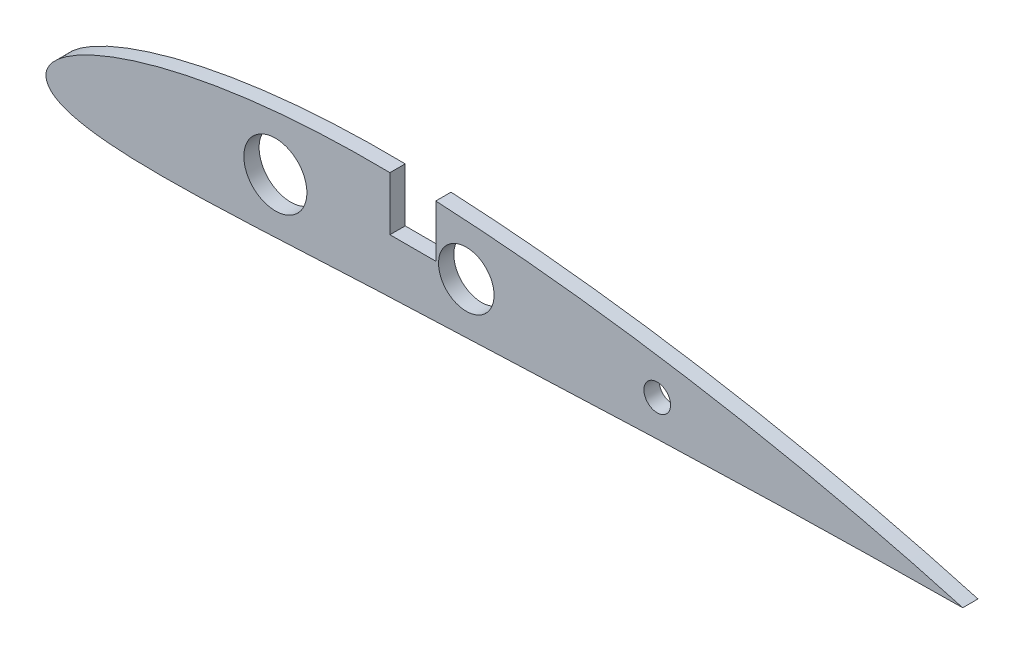
ISO-10303-21;
HEADER;
FILE_DESCRIPTION(('STEP AP214'),'2;1');
FILE_NAME('part.step','',(''),(''),'','','');
FILE_SCHEMA(('AUTOMOTIVE_DESIGN { 1 0 10303 214 1 1 1 1 }'));
ENDSEC;
DATA;
#1=APPLICATION_CONTEXT('core data for automotive mechanical design processes');
#2=APPLICATION_PROTOCOL_DEFINITION('international standard','automotive_design',2000,#1);
#3=PRODUCT_CONTEXT('',#1,'mechanical');
#4=PRODUCT('Part','Part','',(#3));
#5=PRODUCT_RELATED_PRODUCT_CATEGORY('part','',(#4));
#6=PRODUCT_DEFINITION_FORMATION('','',#4);
#7=PRODUCT_DEFINITION_CONTEXT('part definition',#1,'design');
#8=PRODUCT_DEFINITION('design','',#6,#7);
#9=PRODUCT_DEFINITION_SHAPE('','',#8);
#10=(LENGTH_UNIT() NAMED_UNIT(*) SI_UNIT(.MILLI.,.METRE.));
#11=(NAMED_UNIT(*) PLANE_ANGLE_UNIT() SI_UNIT($,.RADIAN.));
#12=(NAMED_UNIT(*) SI_UNIT($,.STERADIAN.) SOLID_ANGLE_UNIT());
#13=UNCERTAINTY_MEASURE_WITH_UNIT(LENGTH_MEASURE(1.E-05),#10,'distance_accuracy_value','');
#14=(GEOMETRIC_REPRESENTATION_CONTEXT(3) GLOBAL_UNCERTAINTY_ASSIGNED_CONTEXT((#13)) GLOBAL_UNIT_ASSIGNED_CONTEXT((#10,
#11,#12)) REPRESENTATION_CONTEXT('',''));
#15=CARTESIAN_POINT('',(0.,0.,0.));
#16=DIRECTION('',(0.,0.,1.));
#17=DIRECTION('',(1.,0.,0.));
#18=AXIS2_PLACEMENT_3D('',#15,#16,#17);
#19=CARTESIAN_POINT('',(240.,0.,4.));
#20=CARTESIAN_POINT('',(237.546398163448,0.68438543221875,4.));
#21=CARTESIAN_POINT('',(232.640819939116,2.05270290872528,4.));
#22=CARTESIAN_POINT('',(225.253408528126,3.98966258912179,4.));
#23=CARTESIAN_POINT('',(217.849539662704,5.84383763989185,4.));
#24=CARTESIAN_POINT('',(210.427797340328,7.60857340531703,4.));
#25=CARTESIAN_POINT('',(202.989689486897,9.28748088681427,4.));
#26=CARTESIAN_POINT('',(195.535844753439,10.8809301447552,4.));
#27=CARTESIAN_POINT('',(188.06704799779,12.3896611860168,4.));
#28=CARTESIAN_POINT('',(180.583977278672,13.813795242563,4.));
#29=CARTESIAN_POINT('',(173.087293463989,15.1530936944043,4.));
#30=CARTESIAN_POINT('',(165.577630233609,16.4068599196889,4.));
#31=CARTESIAN_POINT('',(158.055616956506,17.5739504528987,4.));
#32=CARTESIAN_POINT('',(150.521889928624,18.6527459218232,4.));
#33=CARTESIAN_POINT('',(142.977108491338,19.6411249772645,4.));
#34=CARTESIAN_POINT('',(135.421970655733,20.5364355054947,4.));
#35=CARTESIAN_POINT('',(127.857230033589,21.3354646143863,4.));
#36=CARTESIAN_POINT('',(120.283713821644,22.0343417726445,4.));
#37=CARTESIAN_POINT('',(112.702347417195,22.6286597620305,4.));
#38=CARTESIAN_POINT('',(105.114156567423,23.1127246904831,4.));
#39=CARTESIAN_POINT('',(98.7737272916136,23.4209842066962,4.));
#40=CARTESIAN_POINT('',(93.6764317786696,23.6041939670902,4.));
#41=CARTESIAN_POINT('',(89.8234143506245,23.6906819548681,4.));
#42=CARTESIAN_POINT('',(85.9609513745677,23.7283429753413,4.));
#43=CARTESIAN_POINT('',(82.0975366705078,23.7146507696699,4.));
#44=CARTESIAN_POINT('',(78.2337405280987,23.6486229503553,4.));
#45=CARTESIAN_POINT('',(74.3701600908093,23.5287756963517,4.));
#46=CARTESIAN_POINT('',(70.5074473032435,23.3535942380793,4.));
#47=CARTESIAN_POINT('',(66.6463080678426,23.1213965218449,4.));
#48=CARTESIAN_POINT('',(62.7875133309113,22.8303226481203,4.));
#49=CARTESIAN_POINT('',(58.9319055701774,22.4783046148205,4.));
#50=CARTESIAN_POINT('',(55.0804111960497,22.0630267435625,4.));
#51=CARTESIAN_POINT('',(51.2340542878614,21.5818576892265,4.));
#52=CARTESIAN_POINT('',(47.3939751721847,21.0317854962164,4.));
#53=CARTESIAN_POINT('',(43.5614532760915,20.4093125109229,4.));
#54=CARTESIAN_POINT('',(39.7379401854474,19.7103089099579,4.));
#55=CARTESIAN_POINT('',(35.9251005462339,18.9298268923764,4.));
#56=CARTESIAN_POINT('',(32.1248734596197,18.0617845251042,4.));
#57=CARTESIAN_POINT('',(28.3395601608733,17.0985386001955,4.));
#58=CARTESIAN_POINT('',(24.5719194437555,16.030165468402,4.));
#59=CARTESIAN_POINT('',(20.8254457895806,14.8432633760495,4.));
#60=CARTESIAN_POINT('',(17.7294763588098,13.7414025942725,4.));
#61=CARTESIAN_POINT('',(15.2715379666686,12.7782951527238,4.));
#62=CARTESIAN_POINT('',(13.4346346766995,12.0081487224816,4.));
#63=CARTESIAN_POINT('',(11.6087123205526,11.1846791792566,4.));
#64=CARTESIAN_POINT('',(9.79557922061116,10.2986273067824,4.));
#65=CARTESIAN_POINT('',(7.99748807637526,9.33664563665943,4.));
#66=CARTESIAN_POINT('',(6.21745514979955,8.27803244782277,4.));
#67=CARTESIAN_POINT('',(4.76469382907871,7.29468167032907,4.));
#68=CARTESIAN_POINT('',(3.62728335611465,6.41875852572643,4.));
#69=CARTESIAN_POINT('',(2.7777980612349,5.69230249163584,4.));
#70=CARTESIAN_POINT('',(2.09171453064622,5.02247613571121,4.));
#71=CARTESIAN_POINT('',(1.55938709467948,4.42805688408716,4.));
#72=CARTESIAN_POINT('',(1.16158378737056,3.93118782086932,4.));
#73=CARTESIAN_POINT('',(0.773081643879084,3.37045685279267,4.));
#74=CARTESIAN_POINT('',(0.472341280892494,2.83846605580259,4.));
#75=CARTESIAN_POINT('',(0.250371603797577,2.3423218244989,4.));
#76=CARTESIAN_POINT('',(0.121591355910279,1.97692053438318,4.));
#77=CARTESIAN_POINT('',(0.0305975318413246,1.63556785887762,4.));
#78=CARTESIAN_POINT('',(-0.0330360913705665,1.31221471439914,4.));
#79=CARTESIAN_POINT('',(-0.0686987001939404,0.982013321074926,4.));
#80=CARTESIAN_POINT('',(-0.0743878133196132,0.690065352178659,4.));
#81=CARTESIAN_POINT('',(-0.065440983578077,0.485978709247092,4.));
#82=CARTESIAN_POINT('',(-0.0526827194435099,0.342725742772213,4.));
#83=CARTESIAN_POINT('',(-0.0404531437231534,0.241913365348648,4.));
#84=CARTESIAN_POINT('',(-0.030210584963935,0.170851792744893,4.));
#85=CARTESIAN_POINT('',(-0.0221533228951001,0.120712696650328,4.));
#86=CARTESIAN_POINT('',(-0.0127660058718612,0.065915068128088,4.));
#87=CARTESIAN_POINT('',(-0.00528863713523693,0.0273069651207246,4.));
#88=CARTESIAN_POINT('',(0.,0.,4.));
#89=B_SPLINE_CURVE_WITH_KNOTS('',3,(#19,#20,#21,#22,#23,#24,#25,#26,#27,#28,#29,#30,#31,#32,#33,
#34,#35,#36,#37,#38,#39,#40,#41,#42,#43,#44,#45,#46,#47,#48,#49,#50,#51,#52,#53,#54,#55,#56,#57,
#58,#59,#60,#61,#62,#63,#64,#65,#66,#67,#68,#69,#70,#71,#72,#73,#74,#75,#76,#77,#78,#79,#80,#81,
#82,#83,#84,#85,#86,#87,#88),.UNSPECIFIED.,.F.,.F.,(4,1,1,1,1,1,1,1,1,1,1,1,1,1,1,1,1,1,1,1,1,1,
1,1,1,1,1,1,1,1,1,1,1,1,1,1,1,1,1,1,1,1,1,1,1,1,1,1,1,1,1,1,1,1,1,1,1,1,1,1,1,1,1,1,1,1,1,4),
(0.,0.0306594649235676,0.0612986187319187,0.0919199800038157,0.122525786299512,
0.153118005416587,0.183698363539087,0.214268363315346,0.244829291329636,0.275382240360336,
0.305928112605,0.336467648969757,0.367001417779571,0.397529857815328,0.428053291009774,
0.458571947361171,0.489086013675504,0.519595662644765,0.550101143066023,0.580602861222506,
0.595998388288711,0.611492665578709,0.626989519479671,0.642489486678354,0.657993122657847,
0.67350103442709,0.689013887955131,0.704532414060766,0.720057451539895,0.735589953864026,
0.751131051829073,0.766682089901341,0.782244713822456,0.797820964521903,0.813413441711977,
0.829025525472764,0.844661719207215,0.860328230896368,0.87603391558221,0.891791969077039,
0.907623251333689,0.915577033514861,0.923564431516983,0.931595025271261,0.939682919984796,
0.947850088314032,0.956133337959742,0.964601174812097,0.96894607093755,0.973407000180128,
0.978048115303839,0.980474089463927,0.983007716126103,0.985704252709353,0.988677446655626,
0.990347171252439,0.992241641582714,0.993333108792967,0.994597064465399,0.996204883907087,
0.997323330172724,0.998108671313999,0.998662572391472,0.999054007100133,0.999330845740475,
0.999526684325646,0.999665230518883,1.),.UNSPECIFIED.);
#90=DIRECTION('',(0.,0.,-1.));
#91=VECTOR('',#90,1.);
#92=SURFACE_OF_LINEAR_EXTRUSION('',#89,#91);
#93=CARTESIAN_POINT('',(90.,23.6796163414405,4.));
#94=VERTEX_POINT('',#93);
#95=CARTESIAN_POINT('',(0.,0.,4.));
#96=VERTEX_POINT('',#95);
#97=EDGE_CURVE('E78',#94,#96,#89,.T.);
#98=ORIENTED_EDGE('',*,*,#97,.F.);
#99=DIRECTION('',(0.,0.,-1.));
#100=VECTOR('',#99,1.);
#101=CARTESIAN_POINT('',(90.,23.6796163414405,4.));
#102=LINE('',#101,#100);
#103=CARTESIAN_POINT('',(90.,23.6796163414594,0.));
#104=VERTEX_POINT('',#103);
#105=EDGE_CURVE('E98',#94,#104,#102,.T.);
#106=ORIENTED_EDGE('',*,*,#105,.T.);
#107=CARTESIAN_POINT('',(240.,0.,0.));
#108=CARTESIAN_POINT('',(237.546398163448,0.68438543221875,0.));
#109=CARTESIAN_POINT('',(232.640819939116,2.05270290872528,0.));
#110=CARTESIAN_POINT('',(225.253408528126,3.98966258912179,0.));
#111=CARTESIAN_POINT('',(217.849539662704,5.84383763989185,0.));
#112=CARTESIAN_POINT('',(210.427797340328,7.60857340531703,0.));
#113=CARTESIAN_POINT('',(202.989689486897,9.28748088681427,0.));
#114=CARTESIAN_POINT('',(195.535844753439,10.8809301447552,0.));
#115=CARTESIAN_POINT('',(188.06704799779,12.3896611860168,0.));
#116=CARTESIAN_POINT('',(180.583977278672,13.813795242563,0.));
#117=CARTESIAN_POINT('',(173.087293463989,15.1530936944043,0.));
#118=CARTESIAN_POINT('',(165.577630233609,16.4068599196889,0.));
#119=CARTESIAN_POINT('',(158.055616956506,17.5739504528987,0.));
#120=CARTESIAN_POINT('',(150.521889928624,18.6527459218232,0.));
#121=CARTESIAN_POINT('',(142.977108491338,19.6411249772645,0.));
#122=CARTESIAN_POINT('',(135.421970655733,20.5364355054947,0.));
#123=CARTESIAN_POINT('',(127.857230033589,21.3354646143863,0.));
#124=CARTESIAN_POINT('',(120.283713821644,22.0343417726445,0.));
#125=CARTESIAN_POINT('',(112.702347417195,22.6286597620305,0.));
#126=CARTESIAN_POINT('',(105.114156567423,23.1127246904831,0.));
#127=CARTESIAN_POINT('',(98.7737272916136,23.4209842066962,0.));
#128=CARTESIAN_POINT('',(93.6764317786696,23.6041939670902,0.));
#129=CARTESIAN_POINT('',(89.8234143506245,23.6906819548681,0.));
#130=CARTESIAN_POINT('',(85.9609513745677,23.7283429753413,0.));
#131=CARTESIAN_POINT('',(82.0975366705078,23.7146507696699,0.));
#132=CARTESIAN_POINT('',(78.2337405280987,23.6486229503553,0.));
#133=CARTESIAN_POINT('',(74.3701600908093,23.5287756963517,0.));
#134=CARTESIAN_POINT('',(70.5074473032435,23.3535942380793,0.));
#135=CARTESIAN_POINT('',(66.6463080678426,23.1213965218449,0.));
#136=CARTESIAN_POINT('',(62.7875133309113,22.8303226481203,0.));
#137=CARTESIAN_POINT('',(58.9319055701774,22.4783046148205,0.));
#138=CARTESIAN_POINT('',(55.0804111960497,22.0630267435625,0.));
#139=CARTESIAN_POINT('',(51.2340542878614,21.5818576892265,0.));
#140=CARTESIAN_POINT('',(47.3939751721847,21.0317854962164,0.));
#141=CARTESIAN_POINT('',(43.5614532760915,20.4093125109229,0.));
#142=CARTESIAN_POINT('',(39.7379401854474,19.7103089099579,0.));
#143=CARTESIAN_POINT('',(35.9251005462339,18.9298268923764,0.));
#144=CARTESIAN_POINT('',(32.1248734596197,18.0617845251042,0.));
#145=CARTESIAN_POINT('',(28.3395601608733,17.0985386001955,0.));
#146=CARTESIAN_POINT('',(24.5719194437555,16.030165468402,0.));
#147=CARTESIAN_POINT('',(20.8254457895806,14.8432633760495,0.));
#148=CARTESIAN_POINT('',(17.7294763588098,13.7414025942725,0.));
#149=CARTESIAN_POINT('',(15.2715379666686,12.7782951527238,0.));
#150=CARTESIAN_POINT('',(13.4346346766995,12.0081487224816,0.));
#151=CARTESIAN_POINT('',(11.6087123205526,11.1846791792566,0.));
#152=CARTESIAN_POINT('',(9.79557922061116,10.2986273067824,0.));
#153=CARTESIAN_POINT('',(7.99748807637526,9.33664563665943,0.));
#154=CARTESIAN_POINT('',(6.21745514979955,8.27803244782277,0.));
#155=CARTESIAN_POINT('',(4.76469382907871,7.29468167032907,0.));
#156=CARTESIAN_POINT('',(3.62728335611465,6.41875852572643,0.));
#157=CARTESIAN_POINT('',(2.7777980612349,5.69230249163584,0.));
#158=CARTESIAN_POINT('',(2.09171453064622,5.02247613571121,0.));
#159=CARTESIAN_POINT('',(1.55938709467948,4.42805688408716,0.));
#160=CARTESIAN_POINT('',(1.16158378737056,3.93118782086932,0.));
#161=CARTESIAN_POINT('',(0.773081643879084,3.37045685279267,0.));
#162=CARTESIAN_POINT('',(0.472341280892494,2.83846605580259,0.));
#163=CARTESIAN_POINT('',(0.250371603797577,2.3423218244989,0.));
#164=CARTESIAN_POINT('',(0.121591355910279,1.97692053438318,0.));
#165=CARTESIAN_POINT('',(0.0305975318413246,1.63556785887762,0.));
#166=CARTESIAN_POINT('',(-0.0330360913705665,1.31221471439914,0.));
#167=CARTESIAN_POINT('',(-0.0686987001939404,0.982013321074926,0.));
#168=CARTESIAN_POINT('',(-0.0743878133196132,0.690065352178659,0.));
#169=CARTESIAN_POINT('',(-0.065440983578077,0.485978709247092,0.));
#170=CARTESIAN_POINT('',(-0.0526827194435099,0.342725742772213,0.));
#171=CARTESIAN_POINT('',(-0.0404531437231534,0.241913365348648,0.));
#172=CARTESIAN_POINT('',(-0.030210584963935,0.170851792744893,0.));
#173=CARTESIAN_POINT('',(-0.0221533228951001,0.120712696650328,0.));
#174=CARTESIAN_POINT('',(-0.0127660058718612,0.065915068128088,0.));
#175=CARTESIAN_POINT('',(-0.00528863713523693,0.0273069651207246,0.));
#176=CARTESIAN_POINT('',(0.,0.,0.));
#177=B_SPLINE_CURVE_WITH_KNOTS('',3,(#107,#108,#109,#110,#111,#112,#113,#114,#115,#116,#117,
#118,#119,#120,#121,#122,#123,#124,#125,#126,#127,#128,#129,#130,#131,#132,#133,#134,#135,#136,
#137,#138,#139,#140,#141,#142,#143,#144,#145,#146,#147,#148,#149,#150,#151,#152,#153,#154,#155,
#156,#157,#158,#159,#160,#161,#162,#163,#164,#165,#166,#167,#168,#169,#170,#171,#172,#173,#174,
#175,#176),.UNSPECIFIED.,.F.,.F.,(4,1,1,1,1,1,1,1,1,1,1,1,1,1,1,1,1,1,1,1,1,1,1,1,1,1,1,1,1,1,1,
1,1,1,1,1,1,1,1,1,1,1,1,1,1,1,1,1,1,1,1,1,1,1,1,1,1,1,1,1,1,1,1,1,1,1,1,4),(0.,
0.0306594649235676,0.0612986187319187,0.0919199800038157,0.122525786299512,0.153118005416587,
0.183698363539087,0.214268363315346,0.244829291329636,0.275382240360336,0.305928112605,
0.336467648969757,0.367001417779571,0.397529857815328,0.428053291009774,0.458571947361171,
0.489086013675504,0.519595662644765,0.550101143066023,0.580602861222506,0.595998388288711,
0.611492665578709,0.626989519479671,0.642489486678354,0.657993122657847,0.67350103442709,
0.689013887955131,0.704532414060766,0.720057451539895,0.735589953864026,0.751131051829073,
0.766682089901341,0.782244713822456,0.797820964521903,0.813413441711977,0.829025525472764,
0.844661719207215,0.860328230896368,0.87603391558221,0.891791969077039,0.907623251333689,
0.915577033514861,0.923564431516983,0.931595025271261,0.939682919984796,0.947850088314032,
0.956133337959742,0.964601174812097,0.96894607093755,0.973407000180128,0.978048115303839,
0.980474089463927,0.983007716126103,0.985704252709353,0.988677446655626,0.990347171252439,
0.992241641582714,0.993333108792967,0.994597064465399,0.996204883907087,0.997323330172724,
0.998108671313999,0.998662572391472,0.999054007100133,0.999330845740475,0.999526684325646,
0.999665230518883,1.),.UNSPECIFIED.);
#178=CARTESIAN_POINT('',(0.,0.,0.));
#179=VERTEX_POINT('',#178);
#180=EDGE_CURVE('E92',#104,#179,#177,.T.);
#181=ORIENTED_EDGE('',*,*,#180,.T.);
#182=DIRECTION('',(0.,0.,-1.));
#183=VECTOR('',#182,1.);
#184=CARTESIAN_POINT('',(0.,0.,4.));
#185=LINE('',#184,#183);
#186=EDGE_CURVE('E94',#96,#179,#185,.T.);
#187=ORIENTED_EDGE('',*,*,#186,.F.);
#188=EDGE_LOOP('',(#98,#106,#181,#187));
#189=FACE_BOUND('',#188,.T.);
#190=ADVANCED_FACE('F51',(#189),#92,.F.);
#191=CARTESIAN_POINT('',(0.,0.,4.));
#192=CARTESIAN_POINT('',(0.00562068129353922,-0.0272406221001108,4.));
#193=CARTESIAN_POINT('',(0.0135674536698496,-0.0657546405817319,4.));
#194=CARTESIAN_POINT('',(0.0259778278612629,-0.119947575019034,4.));
#195=CARTESIAN_POINT('',(0.0378230459850581,-0.169329157551741,4.));
#196=CARTESIAN_POINT('',(0.0556949604320902,-0.238865361495108,4.));
#197=CARTESIAN_POINT('',(0.0831684630072189,-0.336628772032636,4.));
#198=CARTESIAN_POINT('',(0.126453790289481,-0.473775419733848,4.));
#199=CARTESIAN_POINT('',(0.196588610067144,-0.665620959055068,4.));
#200=CARTESIAN_POINT('',(0.313835580353549,-0.932970965132324,4.));
#201=CARTESIAN_POINT('',(0.473117663938234,-1.22421341048862,4.));
#202=CARTESIAN_POINT('',(0.65520100409205,-1.49857654182686,4.));
#203=CARTESIAN_POINT('',(0.868943424309464,-1.77917402952097,4.));
#204=CARTESIAN_POINT('',(1.12605340720852,-2.0677766459612,4.));
#205=CARTESIAN_POINT('',(1.51744671959063,-2.44210571108681,4.));
#206=CARTESIAN_POINT('',(1.99324596192459,-2.82047494925701,4.));
#207=CARTESIAN_POINT('',(2.55876920976797,-3.19374428892925,4.));
#208=CARTESIAN_POINT('',(3.10735490830802,-3.50554862744462,4.));
#209=CARTESIAN_POINT('',(3.81295245144565,-3.85871094182681,4.));
#210=CARTESIAN_POINT('',(4.68400162409777,-4.22746291746812,4.));
#211=CARTESIAN_POINT('',(5.72186064347461,-4.59317232320399,4.));
#212=CARTESIAN_POINT('',(7.07063002044959,-4.99798626758871,4.));
#213=CARTESIAN_POINT('',(8.7381766545503,-5.39945123706318,4.));
#214=CARTESIAN_POINT('',(10.7230858057148,-5.77150749309047,4.));
#215=CARTESIAN_POINT('',(12.6835058735096,-6.06268701513824,4.));
#216=CARTESIAN_POINT('',(14.6255791215932,-6.29316125865917,4.));
#217=CARTESIAN_POINT('',(17.1862171270835,-6.53596540322896,4.));
#218=CARTESIAN_POINT('',(20.3630998826574,-6.7451722163534,4.));
#219=CARTESIAN_POINT('',(24.1512763201345,-6.89066104903439,4.));
#220=CARTESIAN_POINT('',(27.9105173189538,-6.95770961690465,4.));
#221=CARTESIAN_POINT('',(32.8806029345765,-6.96742399954372,4.));
#222=CARTESIAN_POINT('',(39.053992561385,-6.8651676106754,4.));
#223=CARTESIAN_POINT('',(46.4241367665669,-6.62810822328446,4.));
#224=CARTESIAN_POINT('',(53.755908234886,-6.3201315956361,4.));
#225=CARTESIAN_POINT('',(63.4870650089382,-5.85519136002525,4.));
#226=CARTESIAN_POINT('',(75.6227748089325,-5.23084046877293,4.));
#227=CARTESIAN_POINT('',(87.7603398769355,-4.64542698838312,4.));
#228=CARTESIAN_POINT('',(97.5147720003334,-4.26138900119527,4.));
#229=CARTESIAN_POINT('',(107.362573716476,-3.87363795786612,4.));
#230=CARTESIAN_POINT('',(119.728536962578,-3.34918378255684,4.));
#231=CARTESIAN_POINT('',(134.592329131724,-2.72283531862702,4.));
#232=CARTESIAN_POINT('',(149.494278081763,-2.12765973142181,4.));
#233=CARTESIAN_POINT('',(164.440499208885,-1.58833441556034,4.));
#234=CARTESIAN_POINT('',(179.436342049946,-1.1194885159915,4.));
#235=CARTESIAN_POINT('',(194.487002613288,-0.728245316351359,4.));
#236=CARTESIAN_POINT('',(209.598003821933,-0.415904891379394,4.));
#237=CARTESIAN_POINT('',(224.775588821832,-0.17248102353113,4.));
#238=CARTESIAN_POINT('',(234.917110018193,-0.0575852856506796,4.));
#239=CARTESIAN_POINT('',(240.,0.,4.));
#240=B_SPLINE_CURVE_WITH_KNOTS('',3,(#191,#192,#193,#194,#195,#196,#197,#198,#199,#200,#201,
#202,#203,#204,#205,#206,#207,#208,#209,#210,#211,#212,#213,#214,#215,#216,#217,#218,#219,#220,
#221,#222,#223,#224,#225,#226,#227,#228,#229,#230,#231,#232,#233,#234,#235,#236,#237,#238,#239),
.UNSPECIFIED.,.F.,.F.,(4,1,1,1,1,1,1,1,1,1,1,1,1,1,1,1,1,1,1,1,1,1,1,1,1,1,1,1,1,1,1,1,1,1,1,1,
1,1,1,1,1,1,1,1,1,1,4),(0.,0.000344396090967702,0.000486922705501436,0.000688393724961212,
0.000973194654399046,0.00137588390593901,0.00194569747633444,0.00275357981829027,
0.00390401861347955,0.00555741512150298,0.00685664007360376,0.00797801217093519,
0.00992291422043412,0.0116352316449012,0.0146794606449364,0.0174347140142255,0.0200185506044736,
0.0224882181649999,0.0272017244266385,0.0317192579929571,0.0361081634329116,0.0446339489883064,
0.0529422593834259,0.0611075210040883,0.0691704884372124,0.0771560021504698,0.0929545498484583,
0.108585417775429,0.124093824824671,0.13950809029709,0.17012566844974,0.20054031758713,
0.230814163838843,0.260990346007664,0.321173353917399,0.381283479157831,0.411456267635643,
0.442050623932973,0.503318267477411,0.56471504081712,0.626264685044353,0.687988229948997,
0.749906244265567,0.812040409729135,0.874414837277642,0.937057217245266,1.),.UNSPECIFIED.);
#241=DIRECTION('',(0.,0.,-1.));
#242=VECTOR('',#241,1.);
#243=SURFACE_OF_LINEAR_EXTRUSION('',#240,#242);
#244=CARTESIAN_POINT('',(0.,0.,0.));
#245=CARTESIAN_POINT('',(0.00562068129353922,-0.0272406221001108,0.));
#246=CARTESIAN_POINT('',(0.0135674536698496,-0.0657546405817319,0.));
#247=CARTESIAN_POINT('',(0.0259778278612629,-0.119947575019034,0.));
#248=CARTESIAN_POINT('',(0.0378230459850581,-0.169329157551741,0.));
#249=CARTESIAN_POINT('',(0.0556949604320902,-0.238865361495108,0.));
#250=CARTESIAN_POINT('',(0.0831684630072189,-0.336628772032636,0.));
#251=CARTESIAN_POINT('',(0.126453790289481,-0.473775419733848,0.));
#252=CARTESIAN_POINT('',(0.196588610067144,-0.665620959055068,0.));
#253=CARTESIAN_POINT('',(0.313835580353549,-0.932970965132324,0.));
#254=CARTESIAN_POINT('',(0.473117663938234,-1.22421341048862,0.));
#255=CARTESIAN_POINT('',(0.65520100409205,-1.49857654182686,0.));
#256=CARTESIAN_POINT('',(0.868943424309464,-1.77917402952097,0.));
#257=CARTESIAN_POINT('',(1.12605340720852,-2.0677766459612,0.));
#258=CARTESIAN_POINT('',(1.51744671959063,-2.44210571108681,0.));
#259=CARTESIAN_POINT('',(1.99324596192459,-2.82047494925701,0.));
#260=CARTESIAN_POINT('',(2.55876920976797,-3.19374428892925,0.));
#261=CARTESIAN_POINT('',(3.10735490830802,-3.50554862744462,0.));
#262=CARTESIAN_POINT('',(3.81295245144565,-3.85871094182681,0.));
#263=CARTESIAN_POINT('',(4.68400162409777,-4.22746291746812,0.));
#264=CARTESIAN_POINT('',(5.72186064347461,-4.59317232320399,0.));
#265=CARTESIAN_POINT('',(7.07063002044959,-4.99798626758871,0.));
#266=CARTESIAN_POINT('',(8.7381766545503,-5.39945123706318,0.));
#267=CARTESIAN_POINT('',(10.7230858057148,-5.77150749309047,0.));
#268=CARTESIAN_POINT('',(12.6835058735096,-6.06268701513824,0.));
#269=CARTESIAN_POINT('',(14.6255791215932,-6.29316125865917,0.));
#270=CARTESIAN_POINT('',(17.1862171270835,-6.53596540322896,0.));
#271=CARTESIAN_POINT('',(20.3630998826574,-6.7451722163534,0.));
#272=CARTESIAN_POINT('',(24.1512763201345,-6.89066104903439,0.));
#273=CARTESIAN_POINT('',(27.9105173189538,-6.95770961690465,0.));
#274=CARTESIAN_POINT('',(32.8806029345765,-6.96742399954372,0.));
#275=CARTESIAN_POINT('',(39.053992561385,-6.8651676106754,0.));
#276=CARTESIAN_POINT('',(46.4241367665669,-6.62810822328446,0.));
#277=CARTESIAN_POINT('',(53.755908234886,-6.3201315956361,0.));
#278=CARTESIAN_POINT('',(63.4870650089382,-5.85519136002525,0.));
#279=CARTESIAN_POINT('',(75.6227748089325,-5.23084046877293,0.));
#280=CARTESIAN_POINT('',(87.7603398769355,-4.64542698838312,0.));
#281=CARTESIAN_POINT('',(97.5147720003334,-4.26138900119527,0.));
#282=CARTESIAN_POINT('',(107.362573716476,-3.87363795786612,0.));
#283=CARTESIAN_POINT('',(119.728536962578,-3.34918378255684,0.));
#284=CARTESIAN_POINT('',(134.592329131724,-2.72283531862702,0.));
#285=CARTESIAN_POINT('',(149.494278081763,-2.12765973142181,0.));
#286=CARTESIAN_POINT('',(164.440499208885,-1.58833441556034,0.));
#287=CARTESIAN_POINT('',(179.436342049946,-1.1194885159915,0.));
#288=CARTESIAN_POINT('',(194.487002613288,-0.728245316351359,0.));
#289=CARTESIAN_POINT('',(209.598003821933,-0.415904891379394,0.));
#290=CARTESIAN_POINT('',(224.775588821832,-0.17248102353113,0.));
#291=CARTESIAN_POINT('',(234.917110018193,-0.0575852856506796,0.));
#292=CARTESIAN_POINT('',(240.,0.,0.));
#293=B_SPLINE_CURVE_WITH_KNOTS('',3,(#244,#245,#246,#247,#248,#249,#250,#251,#252,#253,#254,
#255,#256,#257,#258,#259,#260,#261,#262,#263,#264,#265,#266,#267,#268,#269,#270,#271,#272,#273,
#274,#275,#276,#277,#278,#279,#280,#281,#282,#283,#284,#285,#286,#287,#288,#289,#290,#291,#292),
.UNSPECIFIED.,.F.,.F.,(4,1,1,1,1,1,1,1,1,1,1,1,1,1,1,1,1,1,1,1,1,1,1,1,1,1,1,1,1,1,1,1,1,1,1,1,
1,1,1,1,1,1,1,1,1,1,4),(0.,0.000344396090967702,0.000486922705501436,0.000688393724961212,
0.000973194654399046,0.00137588390593901,0.00194569747633444,0.00275357981829027,
0.00390401861347955,0.00555741512150298,0.00685664007360376,0.00797801217093519,
0.00992291422043412,0.0116352316449012,0.0146794606449364,0.0174347140142255,0.0200185506044736,
0.0224882181649999,0.0272017244266385,0.0317192579929571,0.0361081634329116,0.0446339489883064,
0.0529422593834259,0.0611075210040883,0.0691704884372124,0.0771560021504698,0.0929545498484583,
0.108585417775429,0.124093824824671,0.13950809029709,0.17012566844974,0.20054031758713,
0.230814163838843,0.260990346007664,0.321173353917399,0.381283479157831,0.411456267635643,
0.442050623932973,0.503318267477411,0.56471504081712,0.626264685044353,0.687988229948997,
0.749906244265567,0.812040409729135,0.874414837277642,0.937057217245266,1.),.UNSPECIFIED.);
#294=CARTESIAN_POINT('',(240.,0.,0.));
#295=VERTEX_POINT('',#294);
#296=EDGE_CURVE('E104',#179,#295,#293,.T.);
#297=ORIENTED_EDGE('',*,*,#296,.T.);
#298=DIRECTION('',(0.,0.,-1.));
#299=VECTOR('',#298,1.);
#300=CARTESIAN_POINT('',(240.,0.,4.));
#301=LINE('',#300,#299);
#302=CARTESIAN_POINT('',(240.,0.,4.));
#303=VERTEX_POINT('',#302);
#304=EDGE_CURVE('E111',#303,#295,#301,.T.);
#305=ORIENTED_EDGE('',*,*,#304,.F.);
#306=EDGE_CURVE('E109',#96,#303,#240,.T.);
#307=ORIENTED_EDGE('',*,*,#306,.F.);
#308=ORIENTED_EDGE('',*,*,#186,.T.);
#309=EDGE_LOOP('',(#297,#305,#307,#308));
#310=FACE_BOUND('',#309,.T.);
#311=ADVANCED_FACE('F54',(#310),#243,.F.);
#312=CARTESIAN_POINT('',(102.,23.2587183224116,0.));
#313=VERTEX_POINT('',#312);
#314=EDGE_CURVE('E103',#295,#313,#177,.T.);
#315=ORIENTED_EDGE('',*,*,#314,.T.);
#316=DIRECTION('',(0.,0.,-1.));
#317=VECTOR('',#316,1.);
#318=CARTESIAN_POINT('',(102.,23.2587183221958,4.));
#319=LINE('',#318,#317);
#320=CARTESIAN_POINT('',(102.,23.2587183221958,4.));
#321=VERTEX_POINT('',#320);
#322=EDGE_CURVE('E158',#313,#321,#319,.F.);
#323=ORIENTED_EDGE('',*,*,#322,.T.);
#324=EDGE_CURVE('E112',#303,#321,#89,.T.);
#325=ORIENTED_EDGE('',*,*,#324,.F.);
#326=ORIENTED_EDGE('',*,*,#304,.T.);
#327=EDGE_LOOP('',(#315,#323,#325,#326));
#328=FACE_BOUND('',#327,.T.);
#329=ADVANCED_FACE('F218',(#328),#92,.F.);
#330=CARTESIAN_POINT('',(118.914916861897,-3.38425679445962,4.));
#331=DIRECTION('',(0.,0.,-1.));
#332=DIRECTION('',(-1.,0.,0.));
#333=AXIS2_PLACEMENT_3D('',#330,#331,#332);
#334=PLANE('',#333);
#335=CARTESIAN_POINT('',(160.,7.7037,4.));
#336=DIRECTION('',(0.,0.,1.));
#337=DIRECTION('',(1.,0.,0.));
#338=AXIS2_PLACEMENT_3D('',#335,#336,#337);
#339=CIRCLE('',#338,3.493);
#340=CARTESIAN_POINT('',(163.493,7.7037,4.));
#341=VERTEX_POINT('',#340);
#342=EDGE_CURVE('E188',#341,#341,#339,.T.);
#343=ORIENTED_EDGE('',*,*,#342,.F.);
#344=EDGE_LOOP('',(#343));
#345=FACE_BOUND('',#344,.T.);
#346=CARTESIAN_POINT('',(110.,9.5093,4.));
#347=DIRECTION('',(0.,0.,1.));
#348=DIRECTION('',(1.,0.,0.));
#349=AXIS2_PLACEMENT_3D('',#346,#347,#348);
#350=CIRCLE('',#349,7.273);
#351=CARTESIAN_POINT('',(117.273,9.5093,4.));
#352=VERTEX_POINT('',#351);
#353=EDGE_CURVE('E193',#352,#352,#350,.T.);
#354=ORIENTED_EDGE('',*,*,#353,.F.);
#355=EDGE_LOOP('',(#354));
#356=FACE_BOUND('',#355,.T.);
#357=CARTESIAN_POINT('',(60.,8.25,4.));
#358=DIRECTION('',(0.,0.,1.));
#359=DIRECTION('',(1.,0.,0.));
#360=AXIS2_PLACEMENT_3D('',#357,#358,#359);
#361=CIRCLE('',#360,8.258);
#362=CARTESIAN_POINT('',(68.258,8.25,4.));
#363=VERTEX_POINT('',#362);
#364=EDGE_CURVE('E126',#363,#363,#361,.T.);
#365=ORIENTED_EDGE('',*,*,#364,.F.);
#366=EDGE_LOOP('',(#365));
#367=FACE_BOUND('',#366,.T.);
#368=DIRECTION('',(-1.,0.,0.));
#369=VECTOR('',#368,1.);
#370=CARTESIAN_POINT('',(118.914916861897,9.6,4.));
#371=LINE('',#370,#369);
#372=CARTESIAN_POINT('',(102.,9.6,4.));
#373=VERTEX_POINT('',#372);
#374=CARTESIAN_POINT('',(90.,9.6,4.));
#375=VERTEX_POINT('',#374);
#376=EDGE_CURVE('E175',#373,#375,#371,.T.);
#377=ORIENTED_EDGE('',*,*,#376,.T.);
#378=DIRECTION('',(0.,1.,0.));
#379=VECTOR('',#378,1.);
#380=CARTESIAN_POINT('',(90.,-3.38425679445962,4.));
#381=LINE('',#380,#379);
#382=EDGE_CURVE('E170',#375,#94,#381,.T.);
#383=ORIENTED_EDGE('',*,*,#382,.T.);
#384=ORIENTED_EDGE('',*,*,#97,.T.);
#385=ORIENTED_EDGE('',*,*,#306,.T.);
#386=ORIENTED_EDGE('',*,*,#324,.T.);
#387=DIRECTION('',(0.,-1.,0.));
#388=VECTOR('',#387,1.);
#389=CARTESIAN_POINT('',(102.,-3.38425679445962,4.));
#390=LINE('',#389,#388);
#391=EDGE_CURVE('E182',#321,#373,#390,.T.);
#392=ORIENTED_EDGE('',*,*,#391,.T.);
#393=EDGE_LOOP('',(#377,#383,#384,#385,#386,#392));
#394=FACE_BOUND('',#393,.T.);
#395=ADVANCED_FACE('F215',(#345,#356,#367,#394),#334,.F.);
#396=CARTESIAN_POINT('',(118.914916861897,-3.38425679445962,0.));
#397=DIRECTION('',(0.,0.,-1.));
#398=DIRECTION('',(-1.,0.,0.));
#399=AXIS2_PLACEMENT_3D('',#396,#397,#398);
#400=PLANE('',#399);
#401=DIRECTION('',(0.,1.,0.));
#402=VECTOR('',#401,1.);
#403=CARTESIAN_POINT('',(90.,-3.38425679445962,0.));
#404=LINE('',#403,#402);
#405=CARTESIAN_POINT('',(90.,9.6,0.));
#406=VERTEX_POINT('',#405);
#407=EDGE_CURVE('E11',#406,#104,#404,.T.);
#408=ORIENTED_EDGE('',*,*,#407,.F.);
#409=DIRECTION('',(-1.,0.,0.));
#410=VECTOR('',#409,1.);
#411=CARTESIAN_POINT('',(118.914916861897,9.6,0.));
#412=LINE('',#411,#410);
#413=CARTESIAN_POINT('',(102.,9.6,0.));
#414=VERTEX_POINT('',#413);
#415=EDGE_CURVE('E146',#414,#406,#412,.T.);
#416=ORIENTED_EDGE('',*,*,#415,.F.);
#417=DIRECTION('',(0.,-1.,0.));
#418=VECTOR('',#417,1.);
#419=CARTESIAN_POINT('',(102.,-3.38425679445962,0.));
#420=LINE('',#419,#418);
#421=EDGE_CURVE('E62',#313,#414,#420,.T.);
#422=ORIENTED_EDGE('',*,*,#421,.F.);
#423=ORIENTED_EDGE('',*,*,#314,.F.);
#424=ORIENTED_EDGE('',*,*,#296,.F.);
#425=ORIENTED_EDGE('',*,*,#180,.F.);
#426=EDGE_LOOP('',(#408,#416,#422,#423,#424,#425));
#427=FACE_BOUND('',#426,.T.);
#428=CARTESIAN_POINT('',(160.,7.7037,0.));
#429=DIRECTION('',(0.,0.,1.));
#430=DIRECTION('',(1.,0.,0.));
#431=AXIS2_PLACEMENT_3D('',#428,#429,#430);
#432=CIRCLE('',#431,3.493);
#433=CARTESIAN_POINT('',(163.493,7.7037,0.));
#434=VERTEX_POINT('',#433);
#435=EDGE_CURVE('E189',#434,#434,#432,.T.);
#436=ORIENTED_EDGE('',*,*,#435,.T.);
#437=EDGE_LOOP('',(#436));
#438=FACE_BOUND('',#437,.T.);
#439=CARTESIAN_POINT('',(110.,9.5093,0.));
#440=DIRECTION('',(0.,0.,1.));
#441=DIRECTION('',(1.,0.,0.));
#442=AXIS2_PLACEMENT_3D('',#439,#440,#441);
#443=CIRCLE('',#442,7.273);
#444=CARTESIAN_POINT('',(117.273,9.5093,0.));
#445=VERTEX_POINT('',#444);
#446=EDGE_CURVE('E197',#445,#445,#443,.T.);
#447=ORIENTED_EDGE('',*,*,#446,.T.);
#448=EDGE_LOOP('',(#447));
#449=FACE_BOUND('',#448,.T.);
#450=CARTESIAN_POINT('',(60.,8.25,0.));
#451=DIRECTION('',(0.,0.,1.));
#452=DIRECTION('',(1.,0.,0.));
#453=AXIS2_PLACEMENT_3D('',#450,#451,#452);
#454=CIRCLE('',#453,8.258);
#455=CARTESIAN_POINT('',(68.258,8.25,0.));
#456=VERTEX_POINT('',#455);
#457=EDGE_CURVE('E120',#456,#456,#454,.T.);
#458=ORIENTED_EDGE('',*,*,#457,.T.);
#459=EDGE_LOOP('',(#458));
#460=FACE_BOUND('',#459,.T.);
#461=ADVANCED_FACE('F114',(#427,#438,#449,#460),#400,.T.);
#462=CARTESIAN_POINT('',(60.,8.25,0.));
#463=DIRECTION('',(0.,0.,1.));
#464=DIRECTION('',(1.,0.,0.));
#465=AXIS2_PLACEMENT_3D('',#462,#463,#464);
#466=CYLINDRICAL_SURFACE('',#465,8.258);
#467=ORIENTED_EDGE('',*,*,#457,.F.);
#468=EDGE_LOOP('',(#467));
#469=FACE_BOUND('',#468,.T.);
#470=ORIENTED_EDGE('',*,*,#364,.T.);
#471=EDGE_LOOP('',(#470));
#472=FACE_BOUND('',#471,.T.);
#473=ADVANCED_FACE('F250',(#469,#472),#466,.F.);
#474=CARTESIAN_POINT('',(110.,9.5093,0.));
#475=DIRECTION('',(0.,0.,1.));
#476=DIRECTION('',(1.,0.,0.));
#477=AXIS2_PLACEMENT_3D('',#474,#475,#476);
#478=CYLINDRICAL_SURFACE('',#477,7.273);
#479=ORIENTED_EDGE('',*,*,#446,.F.);
#480=EDGE_LOOP('',(#479));
#481=FACE_BOUND('',#480,.T.);
#482=ORIENTED_EDGE('',*,*,#353,.T.);
#483=EDGE_LOOP('',(#482));
#484=FACE_BOUND('',#483,.T.);
#485=ADVANCED_FACE('F256',(#481,#484),#478,.F.);
#486=CARTESIAN_POINT('',(160.,7.7037,0.));
#487=DIRECTION('',(0.,0.,1.));
#488=DIRECTION('',(1.,0.,0.));
#489=AXIS2_PLACEMENT_3D('',#486,#487,#488);
#490=CYLINDRICAL_SURFACE('',#489,3.493);
#491=ORIENTED_EDGE('',*,*,#435,.F.);
#492=EDGE_LOOP('',(#491));
#493=FACE_BOUND('',#492,.T.);
#494=ORIENTED_EDGE('',*,*,#342,.T.);
#495=EDGE_LOOP('',(#494));
#496=FACE_BOUND('',#495,.T.);
#497=ADVANCED_FACE('F264',(#493,#496),#490,.F.);
#498=CARTESIAN_POINT('',(90.,25.6,-241.074));
#499=DIRECTION('',(-1.,0.,0.));
#500=DIRECTION('',(0.,0.,1.));
#501=AXIS2_PLACEMENT_3D('',#498,#499,#500);
#502=PLANE('',#501);
#503=DIRECTION('',(0.,0.,1.));
#504=VECTOR('',#503,1.);
#505=CARTESIAN_POINT('',(90.,9.6,-241.074));
#506=LINE('',#505,#504);
#507=EDGE_CURVE('E164',#406,#375,#506,.T.);
#508=ORIENTED_EDGE('',*,*,#507,.F.);
#509=ORIENTED_EDGE('',*,*,#407,.T.);
#510=ORIENTED_EDGE('',*,*,#105,.F.);
#511=ORIENTED_EDGE('',*,*,#382,.F.);
#512=EDGE_LOOP('',(#508,#509,#510,#511));
#513=FACE_BOUND('',#512,.T.);
#514=ADVANCED_FACE('F169',(#513),#502,.F.);
#515=CARTESIAN_POINT('',(102.,9.6,-241.074));
#516=DIRECTION('',(1.,0.,0.));
#517=DIRECTION('',(0.,0.,-1.));
#518=AXIS2_PLACEMENT_3D('',#515,#516,#517);
#519=PLANE('',#518);
#520=ORIENTED_EDGE('',*,*,#322,.F.);
#521=ORIENTED_EDGE('',*,*,#421,.T.);
#522=DIRECTION('',(0.,0.,1.));
#523=VECTOR('',#522,1.);
#524=CARTESIAN_POINT('',(102.,9.6,-241.074));
#525=LINE('',#524,#523);
#526=EDGE_CURVE('E69',#414,#373,#525,.T.);
#527=ORIENTED_EDGE('',*,*,#526,.T.);
#528=ORIENTED_EDGE('',*,*,#391,.F.);
#529=EDGE_LOOP('',(#520,#521,#527,#528));
#530=FACE_BOUND('',#529,.T.);
#531=ADVANCED_FACE('F152',(#530),#519,.F.);
#532=CARTESIAN_POINT('',(90.,9.6,-241.074));
#533=DIRECTION('',(0.,-1.,0.));
#534=DIRECTION('',(0.,0.,-1.));
#535=AXIS2_PLACEMENT_3D('',#532,#533,#534);
#536=PLANE('',#535);
#537=ORIENTED_EDGE('',*,*,#526,.F.);
#538=ORIENTED_EDGE('',*,*,#415,.T.);
#539=ORIENTED_EDGE('',*,*,#507,.T.);
#540=ORIENTED_EDGE('',*,*,#376,.F.);
#541=EDGE_LOOP('',(#537,#538,#539,#540));
#542=FACE_BOUND('',#541,.T.);
#543=ADVANCED_FACE('F162',(#542),#536,.F.);
#544=CLOSED_SHELL('',(#190,#311,#329,#395,#461,#473,#485,#497,#514,#531,#543));
#545=MANIFOLD_SOLID_BREP('B2',#544);
#546=ADVANCED_BREP_SHAPE_REPRESENTATION('',(#18,#545),#14);
#547=SHAPE_DEFINITION_REPRESENTATION(#9,#546);
ENDSEC;
END-ISO-10303-21;
